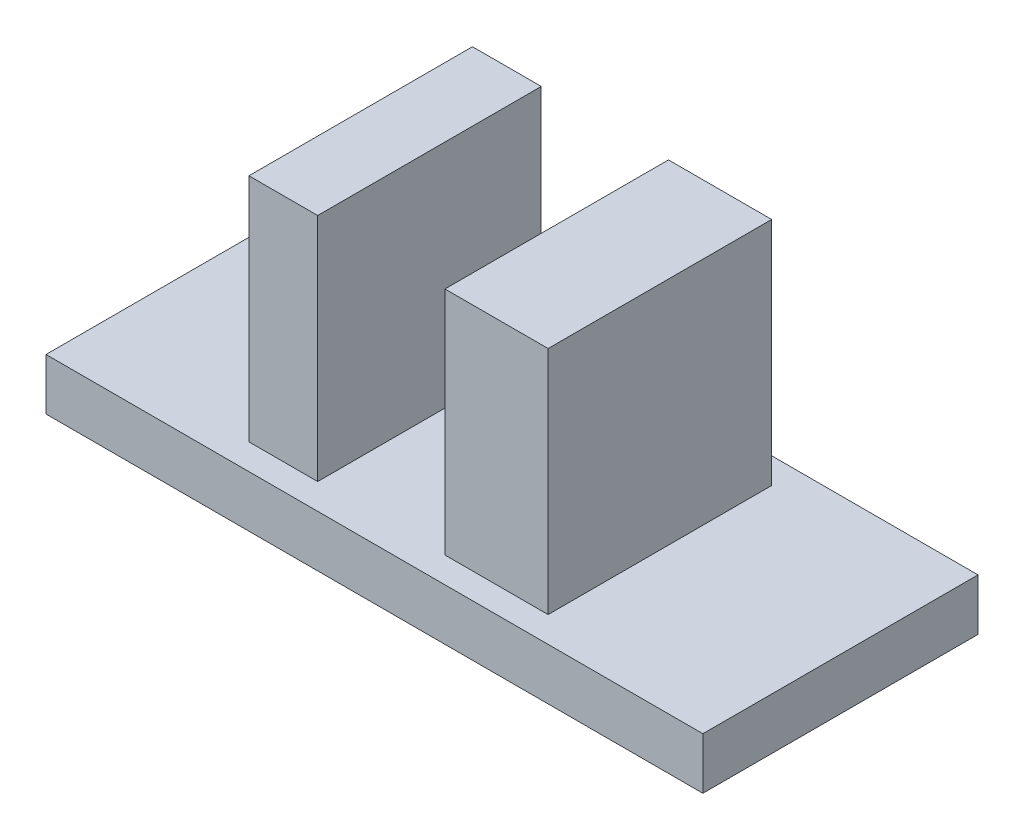
ISO-10303-21;
HEADER;
FILE_DESCRIPTION(('STEP AP214'),'2;1');
FILE_NAME('part.step','',(''),(''),'','','');
FILE_SCHEMA(('AUTOMOTIVE_DESIGN { 1 0 10303 214 1 1 1 1 }'));
ENDSEC;
DATA;
#1=APPLICATION_CONTEXT('core data for automotive mechanical design processes');
#2=APPLICATION_PROTOCOL_DEFINITION('international standard','automotive_design',2000,#1);
#3=PRODUCT_CONTEXT('',#1,'mechanical');
#4=PRODUCT('Part','Part','',(#3));
#5=PRODUCT_RELATED_PRODUCT_CATEGORY('part','',(#4));
#6=PRODUCT_DEFINITION_FORMATION('','',#4);
#7=PRODUCT_DEFINITION_CONTEXT('part definition',#1,'design');
#8=PRODUCT_DEFINITION('design','',#6,#7);
#9=PRODUCT_DEFINITION_SHAPE('','',#8);
#10=(LENGTH_UNIT() NAMED_UNIT(*) SI_UNIT(.MILLI.,.METRE.));
#11=(NAMED_UNIT(*) PLANE_ANGLE_UNIT() SI_UNIT($,.RADIAN.));
#12=(NAMED_UNIT(*) SI_UNIT($,.STERADIAN.) SOLID_ANGLE_UNIT());
#13=UNCERTAINTY_MEASURE_WITH_UNIT(LENGTH_MEASURE(1.E-05),#10,'distance_accuracy_value','');
#14=(GEOMETRIC_REPRESENTATION_CONTEXT(3) GLOBAL_UNCERTAINTY_ASSIGNED_CONTEXT((#13)) GLOBAL_UNIT_ASSIGNED_CONTEXT((#10,
#11,#12)) REPRESENTATION_CONTEXT('',''));
#15=CARTESIAN_POINT('',(0.,0.,0.));
#16=DIRECTION('',(0.,0.,1.));
#17=DIRECTION('',(1.,0.,0.));
#18=AXIS2_PLACEMENT_3D('',#15,#16,#17);
#19=CARTESIAN_POINT('',(0.,15.,0.));
#20=DIRECTION('',(0.,1.,0.));
#21=DIRECTION('',(0.,0.,1.));
#22=AXIS2_PLACEMENT_3D('',#19,#20,#21);
#23=PLANE('',#22);
#24=DIRECTION('',(1.,0.,0.));
#25=VECTOR('',#24,1.);
#26=CARTESIAN_POINT('',(0.,15.,32.5));
#27=LINE('',#26,#25);
#28=CARTESIAN_POINT('',(13.,15.,32.5));
#29=VERTEX_POINT('',#28);
#30=CARTESIAN_POINT('',(43.,15.,32.5));
#31=VERTEX_POINT('',#30);
#32=EDGE_CURVE('E152',#29,#31,#27,.T.);
#33=ORIENTED_EDGE('',*,*,#32,.F.);
#34=DIRECTION('',(0.,0.,-1.));
#35=VECTOR('',#34,1.);
#36=CARTESIAN_POINT('',(13.,15.,0.));
#37=LINE('',#36,#35);
#38=CARTESIAN_POINT('',(13.,15.,-32.5));
#39=VERTEX_POINT('',#38);
#40=EDGE_CURVE('E165',#29,#39,#37,.T.);
#41=ORIENTED_EDGE('',*,*,#40,.T.);
#42=DIRECTION('',(1.,0.,0.));
#43=VECTOR('',#42,1.);
#44=CARTESIAN_POINT('',(0.,15.,-32.5));
#45=LINE('',#44,#43);
#46=CARTESIAN_POINT('',(43.,15.,-32.5));
#47=VERTEX_POINT('',#46);
#48=EDGE_CURVE('E176',#39,#47,#45,.T.);
#49=ORIENTED_EDGE('',*,*,#48,.T.);
#50=DIRECTION('',(0.,0.,-1.));
#51=VECTOR('',#50,1.);
#52=CARTESIAN_POINT('',(43.,15.,0.));
#53=LINE('',#52,#51);
#54=EDGE_CURVE('E155',#31,#47,#53,.T.);
#55=ORIENTED_EDGE('',*,*,#54,.F.);
#56=EDGE_LOOP('',(#33,#41,#49,#55));
#57=FACE_BOUND('',#56,.T.);
#58=DIRECTION('',(1.,0.,0.));
#59=VECTOR('',#58,1.);
#60=CARTESIAN_POINT('',(0.,15.,40.));
#61=LINE('',#60,#59);
#62=CARTESIAN_POINT('',(-95.5,15.,40.));
#63=VERTEX_POINT('',#62);
#64=CARTESIAN_POINT('',(95.5,15.,40.));
#65=VERTEX_POINT('',#64);
#66=EDGE_CURVE('E191',#63,#65,#61,.T.);
#67=ORIENTED_EDGE('',*,*,#66,.T.);
#68=DIRECTION('',(0.,0.,-1.));
#69=VECTOR('',#68,1.);
#70=CARTESIAN_POINT('',(95.5,15.,0.));
#71=LINE('',#70,#69);
#72=CARTESIAN_POINT('',(95.5,15.,-40.));
#73=VERTEX_POINT('',#72);
#74=EDGE_CURVE('E194',#65,#73,#71,.T.);
#75=ORIENTED_EDGE('',*,*,#74,.T.);
#76=DIRECTION('',(1.,0.,0.));
#77=VECTOR('',#76,1.);
#78=CARTESIAN_POINT('',(0.,15.,-40.));
#79=LINE('',#78,#77);
#80=CARTESIAN_POINT('',(-95.5,15.,-40.));
#81=VERTEX_POINT('',#80);
#82=EDGE_CURVE('E197',#81,#73,#79,.T.);
#83=ORIENTED_EDGE('',*,*,#82,.F.);
#84=DIRECTION('',(0.,0.,-1.));
#85=VECTOR('',#84,1.);
#86=CARTESIAN_POINT('',(-95.5,15.,0.));
#87=LINE('',#86,#85);
#88=EDGE_CURVE('E200',#63,#81,#87,.T.);
#89=ORIENTED_EDGE('',*,*,#88,.F.);
#90=EDGE_LOOP('',(#67,#75,#83,#89));
#91=FACE_BOUND('',#90,.T.);
#92=DIRECTION('',(0.,0.,-1.));
#93=VECTOR('',#92,1.);
#94=CARTESIAN_POINT('',(-24.,15.,0.));
#95=LINE('',#94,#93);
#96=CARTESIAN_POINT('',(-24.,15.,32.5));
#97=VERTEX_POINT('',#96);
#98=CARTESIAN_POINT('',(-24.,15.,-32.5));
#99=VERTEX_POINT('',#98);
#100=EDGE_CURVE('E56',#97,#99,#95,.T.);
#101=ORIENTED_EDGE('',*,*,#100,.F.);
#102=DIRECTION('',(1.,0.,0.));
#103=VECTOR('',#102,1.);
#104=CARTESIAN_POINT('',(0.,15.,32.5));
#105=LINE('',#104,#103);
#106=CARTESIAN_POINT('',(-44.,15.,32.5));
#107=VERTEX_POINT('',#106);
#108=EDGE_CURVE('E151',#107,#97,#105,.T.);
#109=ORIENTED_EDGE('',*,*,#108,.F.);
#110=DIRECTION('',(0.,0.,-1.));
#111=VECTOR('',#110,1.);
#112=CARTESIAN_POINT('',(-44.,15.,0.));
#113=LINE('',#112,#111);
#114=CARTESIAN_POINT('',(-44.,15.,-32.5));
#115=VERTEX_POINT('',#114);
#116=EDGE_CURVE('E148',#107,#115,#113,.T.);
#117=ORIENTED_EDGE('',*,*,#116,.T.);
#118=DIRECTION('',(1.,0.,0.));
#119=VECTOR('',#118,1.);
#120=CARTESIAN_POINT('',(0.,15.,-32.5));
#121=LINE('',#120,#119);
#122=EDGE_CURVE('E61',#115,#99,#121,.T.);
#123=ORIENTED_EDGE('',*,*,#122,.T.);
#124=EDGE_LOOP('',(#101,#109,#117,#123));
#125=FACE_BOUND('',#124,.T.);
#126=ADVANCED_FACE('F41',(#57,#91,#125),#23,.T.);
#127=CARTESIAN_POINT('',(0.,15.,40.));
#128=DIRECTION('',(0.,0.,-1.));
#129=DIRECTION('',(-1.,0.,0.));
#130=AXIS2_PLACEMENT_3D('',#127,#128,#129);
#131=PLANE('',#130);
#132=DIRECTION('',(1.,0.,0.));
#133=VECTOR('',#132,1.);
#134=CARTESIAN_POINT('',(0.,0.,40.));
#135=LINE('',#134,#133);
#136=CARTESIAN_POINT('',(-95.5,0.,40.));
#137=VERTEX_POINT('',#136);
#138=CARTESIAN_POINT('',(95.5,0.,40.));
#139=VERTEX_POINT('',#138);
#140=EDGE_CURVE('E190',#137,#139,#135,.T.);
#141=ORIENTED_EDGE('',*,*,#140,.T.);
#142=DIRECTION('',(0.,-1.,0.));
#143=VECTOR('',#142,1.);
#144=CARTESIAN_POINT('',(95.5,15.,40.));
#145=LINE('',#144,#143);
#146=EDGE_CURVE('E11',#65,#139,#145,.T.);
#147=ORIENTED_EDGE('',*,*,#146,.F.);
#148=ORIENTED_EDGE('',*,*,#66,.F.);
#149=DIRECTION('',(0.,-1.,0.));
#150=VECTOR('',#149,1.);
#151=CARTESIAN_POINT('',(-95.5,15.,40.));
#152=LINE('',#151,#150);
#153=EDGE_CURVE('E203',#63,#137,#152,.T.);
#154=ORIENTED_EDGE('',*,*,#153,.T.);
#155=EDGE_LOOP('',(#141,#147,#148,#154));
#156=FACE_BOUND('',#155,.T.);
#157=ADVANCED_FACE('F43',(#156),#131,.F.);
#158=CARTESIAN_POINT('',(95.5,15.,0.));
#159=DIRECTION('',(-1.,0.,0.));
#160=DIRECTION('',(0.,0.,1.));
#161=AXIS2_PLACEMENT_3D('',#158,#159,#160);
#162=PLANE('',#161);
#163=DIRECTION('',(0.,0.,-1.));
#164=VECTOR('',#163,1.);
#165=CARTESIAN_POINT('',(95.5,0.,0.));
#166=LINE('',#165,#164);
#167=CARTESIAN_POINT('',(95.5,0.,-40.));
#168=VERTEX_POINT('',#167);
#169=EDGE_CURVE('E206',#139,#168,#166,.T.);
#170=ORIENTED_EDGE('',*,*,#169,.T.);
#171=DIRECTION('',(0.,-1.,0.));
#172=VECTOR('',#171,1.);
#173=CARTESIAN_POINT('',(95.5,15.,-40.));
#174=LINE('',#173,#172);
#175=EDGE_CURVE('E49',#73,#168,#174,.T.);
#176=ORIENTED_EDGE('',*,*,#175,.F.);
#177=ORIENTED_EDGE('',*,*,#74,.F.);
#178=ORIENTED_EDGE('',*,*,#146,.T.);
#179=EDGE_LOOP('',(#170,#176,#177,#178));
#180=FACE_BOUND('',#179,.T.);
#181=ADVANCED_FACE('F222',(#180),#162,.F.);
#182=CARTESIAN_POINT('',(0.,15.,-40.));
#183=DIRECTION('',(0.,0.,-1.));
#184=DIRECTION('',(-1.,0.,0.));
#185=AXIS2_PLACEMENT_3D('',#182,#183,#184);
#186=PLANE('',#185);
#187=DIRECTION('',(1.,0.,0.));
#188=VECTOR('',#187,1.);
#189=CARTESIAN_POINT('',(0.,0.,-40.));
#190=LINE('',#189,#188);
#191=CARTESIAN_POINT('',(-95.5,0.,-40.));
#192=VERTEX_POINT('',#191);
#193=EDGE_CURVE('E209',#192,#168,#190,.T.);
#194=ORIENTED_EDGE('',*,*,#193,.F.);
#195=DIRECTION('',(0.,-1.,0.));
#196=VECTOR('',#195,1.);
#197=CARTESIAN_POINT('',(-95.5,15.,-40.));
#198=LINE('',#197,#196);
#199=EDGE_CURVE('E215',#81,#192,#198,.T.);
#200=ORIENTED_EDGE('',*,*,#199,.F.);
#201=ORIENTED_EDGE('',*,*,#82,.T.);
#202=ORIENTED_EDGE('',*,*,#175,.T.);
#203=EDGE_LOOP('',(#194,#200,#201,#202));
#204=FACE_BOUND('',#203,.T.);
#205=ADVANCED_FACE('F219',(#204),#186,.T.);
#206=CARTESIAN_POINT('',(-95.5,15.,0.));
#207=DIRECTION('',(-1.,0.,0.));
#208=DIRECTION('',(0.,0.,1.));
#209=AXIS2_PLACEMENT_3D('',#206,#207,#208);
#210=PLANE('',#209);
#211=DIRECTION('',(0.,0.,-1.));
#212=VECTOR('',#211,1.);
#213=CARTESIAN_POINT('',(-95.5,0.,0.));
#214=LINE('',#213,#212);
#215=EDGE_CURVE('E195',#137,#192,#214,.T.);
#216=ORIENTED_EDGE('',*,*,#215,.F.);
#217=ORIENTED_EDGE('',*,*,#153,.F.);
#218=ORIENTED_EDGE('',*,*,#88,.T.);
#219=ORIENTED_EDGE('',*,*,#199,.T.);
#220=EDGE_LOOP('',(#216,#217,#218,#219));
#221=FACE_BOUND('',#220,.T.);
#222=ADVANCED_FACE('F229',(#221),#210,.T.);
#223=CARTESIAN_POINT('',(0.,0.,0.));
#224=DIRECTION('',(0.,1.,0.));
#225=DIRECTION('',(0.,0.,1.));
#226=AXIS2_PLACEMENT_3D('',#223,#224,#225);
#227=PLANE('',#226);
#228=ORIENTED_EDGE('',*,*,#140,.F.);
#229=ORIENTED_EDGE('',*,*,#215,.T.);
#230=ORIENTED_EDGE('',*,*,#193,.T.);
#231=ORIENTED_EDGE('',*,*,#169,.F.);
#232=EDGE_LOOP('',(#228,#229,#230,#231));
#233=FACE_BOUND('',#232,.T.);
#234=ADVANCED_FACE('F226',(#233),#227,.F.);
#235=CARTESIAN_POINT('',(0.,82.,32.5));
#236=DIRECTION('',(0.,0.,-1.));
#237=DIRECTION('',(-1.,0.,0.));
#238=AXIS2_PLACEMENT_3D('',#235,#236,#237);
#239=PLANE('',#238);
#240=ORIENTED_EDGE('',*,*,#32,.T.);
#241=DIRECTION('',(0.,-1.,0.));
#242=VECTOR('',#241,1.);
#243=CARTESIAN_POINT('',(43.,82.,32.5));
#244=LINE('',#243,#242);
#245=CARTESIAN_POINT('',(43.,82.,32.5));
#246=VERTEX_POINT('',#245);
#247=EDGE_CURVE('E187',#246,#31,#244,.T.);
#248=ORIENTED_EDGE('',*,*,#247,.F.);
#249=DIRECTION('',(1.,0.,0.));
#250=VECTOR('',#249,1.);
#251=CARTESIAN_POINT('',(0.,82.,32.5));
#252=LINE('',#251,#250);
#253=CARTESIAN_POINT('',(13.,82.,32.5));
#254=VERTEX_POINT('',#253);
#255=EDGE_CURVE('E161',#254,#246,#252,.T.);
#256=ORIENTED_EDGE('',*,*,#255,.F.);
#257=DIRECTION('',(0.,-1.,0.));
#258=VECTOR('',#257,1.);
#259=CARTESIAN_POINT('',(13.,82.,32.5));
#260=LINE('',#259,#258);
#261=EDGE_CURVE('E172',#254,#29,#260,.T.);
#262=ORIENTED_EDGE('',*,*,#261,.T.);
#263=EDGE_LOOP('',(#240,#248,#256,#262));
#264=FACE_BOUND('',#263,.T.);
#265=ADVANCED_FACE('F247',(#264),#239,.F.);
#266=CARTESIAN_POINT('',(43.,82.,0.));
#267=DIRECTION('',(-1.,0.,0.));
#268=DIRECTION('',(0.,0.,1.));
#269=AXIS2_PLACEMENT_3D('',#266,#267,#268);
#270=PLANE('',#269);
#271=ORIENTED_EDGE('',*,*,#54,.T.);
#272=DIRECTION('',(0.,-1.,0.));
#273=VECTOR('',#272,1.);
#274=CARTESIAN_POINT('',(43.,82.,-32.5));
#275=LINE('',#274,#273);
#276=CARTESIAN_POINT('',(43.,82.,-32.5));
#277=VERTEX_POINT('',#276);
#278=EDGE_CURVE('E184',#277,#47,#275,.T.);
#279=ORIENTED_EDGE('',*,*,#278,.F.);
#280=DIRECTION('',(0.,0.,-1.));
#281=VECTOR('',#280,1.);
#282=CARTESIAN_POINT('',(43.,82.,0.));
#283=LINE('',#282,#281);
#284=EDGE_CURVE('E164',#246,#277,#283,.T.);
#285=ORIENTED_EDGE('',*,*,#284,.F.);
#286=ORIENTED_EDGE('',*,*,#247,.T.);
#287=EDGE_LOOP('',(#271,#279,#285,#286));
#288=FACE_BOUND('',#287,.T.);
#289=ADVANCED_FACE('F289',(#288),#270,.F.);
#290=CARTESIAN_POINT('',(0.,82.,-32.5));
#291=DIRECTION('',(0.,0.,-1.));
#292=DIRECTION('',(-1.,0.,0.));
#293=AXIS2_PLACEMENT_3D('',#290,#291,#292);
#294=PLANE('',#293);
#295=ORIENTED_EDGE('',*,*,#48,.F.);
#296=DIRECTION('',(0.,-1.,0.));
#297=VECTOR('',#296,1.);
#298=CARTESIAN_POINT('',(13.,82.,-32.5));
#299=LINE('',#298,#297);
#300=CARTESIAN_POINT('',(13.,82.,-32.5));
#301=VERTEX_POINT('',#300);
#302=EDGE_CURVE('E181',#301,#39,#299,.T.);
#303=ORIENTED_EDGE('',*,*,#302,.F.);
#304=DIRECTION('',(1.,0.,0.));
#305=VECTOR('',#304,1.);
#306=CARTESIAN_POINT('',(0.,82.,-32.5));
#307=LINE('',#306,#305);
#308=EDGE_CURVE('E167',#301,#277,#307,.T.);
#309=ORIENTED_EDGE('',*,*,#308,.T.);
#310=ORIENTED_EDGE('',*,*,#278,.T.);
#311=EDGE_LOOP('',(#295,#303,#309,#310));
#312=FACE_BOUND('',#311,.T.);
#313=ADVANCED_FACE('F298',(#312),#294,.T.);
#314=CARTESIAN_POINT('',(13.,82.,0.));
#315=DIRECTION('',(-1.,0.,0.));
#316=DIRECTION('',(0.,0.,1.));
#317=AXIS2_PLACEMENT_3D('',#314,#315,#316);
#318=PLANE('',#317);
#319=ORIENTED_EDGE('',*,*,#40,.F.);
#320=ORIENTED_EDGE('',*,*,#261,.F.);
#321=DIRECTION('',(0.,0.,-1.));
#322=VECTOR('',#321,1.);
#323=CARTESIAN_POINT('',(13.,82.,0.));
#324=LINE('',#323,#322);
#325=EDGE_CURVE('E170',#254,#301,#324,.T.);
#326=ORIENTED_EDGE('',*,*,#325,.T.);
#327=ORIENTED_EDGE('',*,*,#302,.T.);
#328=EDGE_LOOP('',(#319,#320,#326,#327));
#329=FACE_BOUND('',#328,.T.);
#330=ADVANCED_FACE('F307',(#329),#318,.T.);
#331=CARTESIAN_POINT('',(0.,82.,0.));
#332=DIRECTION('',(0.,1.,0.));
#333=DIRECTION('',(0.,0.,1.));
#334=AXIS2_PLACEMENT_3D('',#331,#332,#333);
#335=PLANE('',#334);
#336=ORIENTED_EDGE('',*,*,#255,.T.);
#337=ORIENTED_EDGE('',*,*,#284,.T.);
#338=ORIENTED_EDGE('',*,*,#308,.F.);
#339=ORIENTED_EDGE('',*,*,#325,.F.);
#340=EDGE_LOOP('',(#336,#337,#338,#339));
#341=FACE_BOUND('',#340,.T.);
#342=ADVANCED_FACE('F317',(#341),#335,.T.);
#343=CARTESIAN_POINT('',(0.,82.,32.5));
#344=DIRECTION('',(0.,0.,-1.));
#345=DIRECTION('',(-1.,0.,0.));
#346=AXIS2_PLACEMENT_3D('',#343,#344,#345);
#347=PLANE('',#346);
#348=ORIENTED_EDGE('',*,*,#108,.T.);
#349=DIRECTION('',(0.,-1.,0.));
#350=VECTOR('',#349,1.);
#351=CARTESIAN_POINT('',(-24.,82.,32.5));
#352=LINE('',#351,#350);
#353=CARTESIAN_POINT('',(-24.,82.,32.5));
#354=VERTEX_POINT('',#353);
#355=EDGE_CURVE('E132',#354,#97,#352,.T.);
#356=ORIENTED_EDGE('',*,*,#355,.F.);
#357=DIRECTION('',(1.,0.,0.));
#358=VECTOR('',#357,1.);
#359=CARTESIAN_POINT('',(0.,82.,32.5));
#360=LINE('',#359,#358);
#361=CARTESIAN_POINT('',(-44.,82.,32.5));
#362=VERTEX_POINT('',#361);
#363=EDGE_CURVE('E139',#362,#354,#360,.T.);
#364=ORIENTED_EDGE('',*,*,#363,.F.);
#365=DIRECTION('',(0.,-1.,0.));
#366=VECTOR('',#365,1.);
#367=CARTESIAN_POINT('',(-44.,82.,32.5));
#368=LINE('',#367,#366);
#369=EDGE_CURVE('E382',#362,#107,#368,.T.);
#370=ORIENTED_EDGE('',*,*,#369,.T.);
#371=EDGE_LOOP('',(#348,#356,#364,#370));
#372=FACE_BOUND('',#371,.T.);
#373=ADVANCED_FACE('F150',(#372),#347,.F.);
#374=CARTESIAN_POINT('',(-24.,82.,0.));
#375=DIRECTION('',(-1.,0.,0.));
#376=DIRECTION('',(0.,0.,1.));
#377=AXIS2_PLACEMENT_3D('',#374,#375,#376);
#378=PLANE('',#377);
#379=ORIENTED_EDGE('',*,*,#100,.T.);
#380=DIRECTION('',(0.,-1.,0.));
#381=VECTOR('',#380,1.);
#382=CARTESIAN_POINT('',(-24.,82.,-32.5));
#383=LINE('',#382,#381);
#384=CARTESIAN_POINT('',(-24.,82.,-32.5));
#385=VERTEX_POINT('',#384);
#386=EDGE_CURVE('E134',#385,#99,#383,.T.);
#387=ORIENTED_EDGE('',*,*,#386,.F.);
#388=DIRECTION('',(0.,0.,-1.));
#389=VECTOR('',#388,1.);
#390=CARTESIAN_POINT('',(-24.,82.,0.));
#391=LINE('',#390,#389);
#392=EDGE_CURVE('E128',#354,#385,#391,.T.);
#393=ORIENTED_EDGE('',*,*,#392,.F.);
#394=ORIENTED_EDGE('',*,*,#355,.T.);
#395=EDGE_LOOP('',(#379,#387,#393,#394));
#396=FACE_BOUND('',#395,.T.);
#397=ADVANCED_FACE('F130',(#396),#378,.F.);
#398=CARTESIAN_POINT('',(0.,82.,-32.5));
#399=DIRECTION('',(0.,0.,-1.));
#400=DIRECTION('',(-1.,0.,0.));
#401=AXIS2_PLACEMENT_3D('',#398,#399,#400);
#402=PLANE('',#401);
#403=ORIENTED_EDGE('',*,*,#122,.F.);
#404=DIRECTION('',(0.,-1.,0.));
#405=VECTOR('',#404,1.);
#406=CARTESIAN_POINT('',(-44.,82.,-32.5));
#407=LINE('',#406,#405);
#408=CARTESIAN_POINT('',(-44.,82.,-32.5));
#409=VERTEX_POINT('',#408);
#410=EDGE_CURVE('E157',#409,#115,#407,.T.);
#411=ORIENTED_EDGE('',*,*,#410,.F.);
#412=DIRECTION('',(1.,0.,0.));
#413=VECTOR('',#412,1.);
#414=CARTESIAN_POINT('',(0.,82.,-32.5));
#415=LINE('',#414,#413);
#416=EDGE_CURVE('E138',#409,#385,#415,.T.);
#417=ORIENTED_EDGE('',*,*,#416,.T.);
#418=ORIENTED_EDGE('',*,*,#386,.T.);
#419=EDGE_LOOP('',(#403,#411,#417,#418));
#420=FACE_BOUND('',#419,.T.);
#421=ADVANCED_FACE('F350',(#420),#402,.T.);
#422=CARTESIAN_POINT('',(-44.,82.,0.));
#423=DIRECTION('',(-1.,0.,0.));
#424=DIRECTION('',(0.,0.,1.));
#425=AXIS2_PLACEMENT_3D('',#422,#423,#424);
#426=PLANE('',#425);
#427=ORIENTED_EDGE('',*,*,#116,.F.);
#428=ORIENTED_EDGE('',*,*,#369,.F.);
#429=DIRECTION('',(0.,0.,-1.));
#430=VECTOR('',#429,1.);
#431=CARTESIAN_POINT('',(-44.,82.,0.));
#432=LINE('',#431,#430);
#433=EDGE_CURVE('E145',#362,#409,#432,.T.);
#434=ORIENTED_EDGE('',*,*,#433,.T.);
#435=ORIENTED_EDGE('',*,*,#410,.T.);
#436=EDGE_LOOP('',(#427,#428,#434,#435));
#437=FACE_BOUND('',#436,.T.);
#438=ADVANCED_FACE('F359',(#437),#426,.T.);
#439=CARTESIAN_POINT('',(0.,82.,0.));
#440=DIRECTION('',(0.,1.,0.));
#441=DIRECTION('',(0.,0.,1.));
#442=AXIS2_PLACEMENT_3D('',#439,#440,#441);
#443=PLANE('',#442);
#444=ORIENTED_EDGE('',*,*,#363,.T.);
#445=ORIENTED_EDGE('',*,*,#392,.T.);
#446=ORIENTED_EDGE('',*,*,#416,.F.);
#447=ORIENTED_EDGE('',*,*,#433,.F.);
#448=EDGE_LOOP('',(#444,#445,#446,#447));
#449=FACE_BOUND('',#448,.T.);
#450=ADVANCED_FACE('F143',(#449),#443,.T.);
#451=CLOSED_SHELL('',(#126,#157,#181,#205,#222,#234,#265,#289,#313,#330,#342,#373,#397,#421,
#438,#450));
#452=MANIFOLD_SOLID_BREP('B2',#451);
#453=ADVANCED_BREP_SHAPE_REPRESENTATION('',(#18,#452),#14);
#454=SHAPE_DEFINITION_REPRESENTATION(#9,#453);
ENDSEC;
END-ISO-10303-21;
